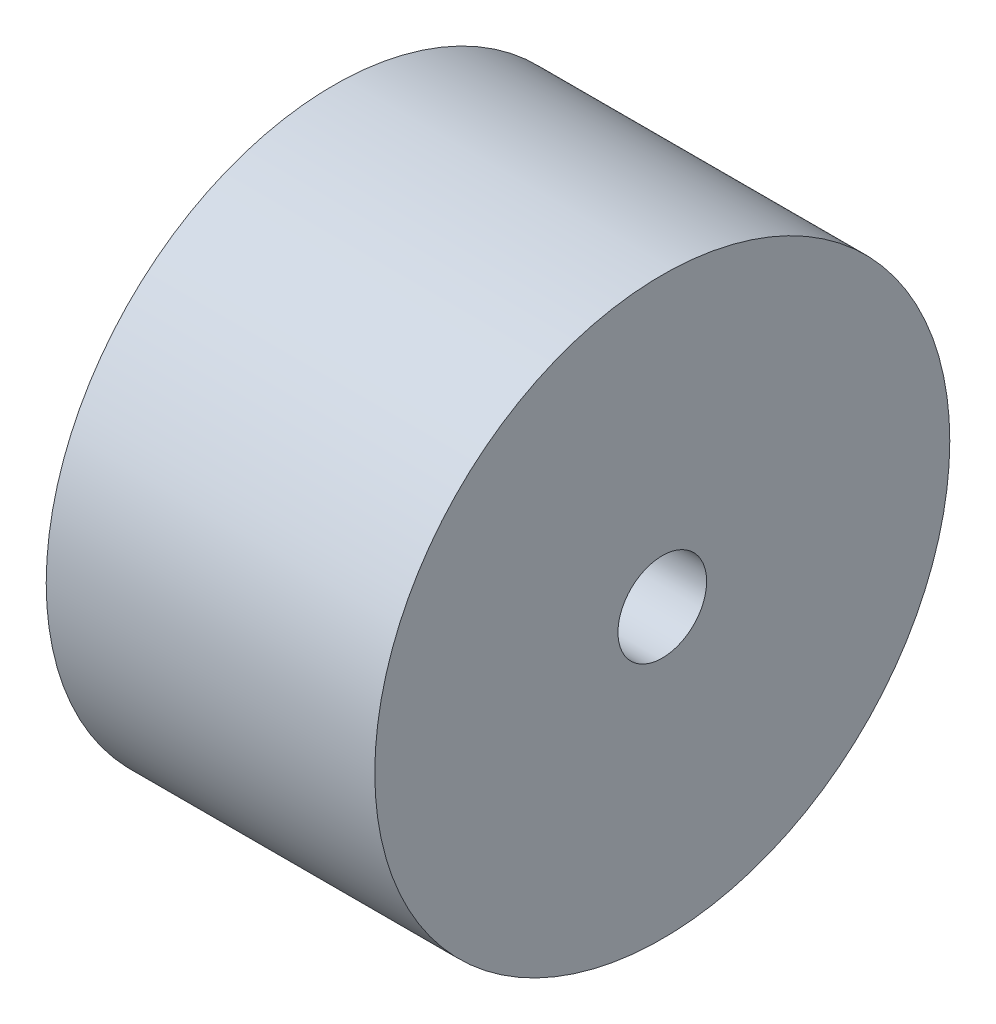
ISO-10303-21;
HEADER;
FILE_DESCRIPTION(('STEP AP214'),'2;1');
FILE_NAME('part.step','',(''),(''),'','','');
FILE_SCHEMA(('AUTOMOTIVE_DESIGN { 1 0 10303 214 1 1 1 1 }'));
ENDSEC;
DATA;
#1=APPLICATION_CONTEXT('core data for automotive mechanical design processes');
#2=APPLICATION_PROTOCOL_DEFINITION('international standard','automotive_design',2000,#1);
#3=PRODUCT_CONTEXT('',#1,'mechanical');
#4=PRODUCT('Part','Part','',(#3));
#5=PRODUCT_RELATED_PRODUCT_CATEGORY('part','',(#4));
#6=PRODUCT_DEFINITION_FORMATION('','',#4);
#7=PRODUCT_DEFINITION_CONTEXT('part definition',#1,'design');
#8=PRODUCT_DEFINITION('design','',#6,#7);
#9=PRODUCT_DEFINITION_SHAPE('','',#8);
#10=(LENGTH_UNIT() NAMED_UNIT(*) SI_UNIT(.MILLI.,.METRE.));
#11=(NAMED_UNIT(*) PLANE_ANGLE_UNIT() SI_UNIT($,.RADIAN.));
#12=(NAMED_UNIT(*) SI_UNIT($,.STERADIAN.) SOLID_ANGLE_UNIT());
#13=UNCERTAINTY_MEASURE_WITH_UNIT(LENGTH_MEASURE(1.E-05),#10,'distance_accuracy_value','');
#14=(GEOMETRIC_REPRESENTATION_CONTEXT(3) GLOBAL_UNCERTAINTY_ASSIGNED_CONTEXT((#13)) GLOBAL_UNIT_ASSIGNED_CONTEXT((#10,
#11,#12)) REPRESENTATION_CONTEXT('',''));
#15=CARTESIAN_POINT('',(0.,0.,0.));
#16=DIRECTION('',(0.,0.,1.));
#17=DIRECTION('',(1.,0.,0.));
#18=AXIS2_PLACEMENT_3D('',#15,#16,#17);
#19=CARTESIAN_POINT('',(20.,0.,0.));
#20=DIRECTION('',(-1.,0.,0.));
#21=DIRECTION('',(0.,0.,1.));
#22=AXIS2_PLACEMENT_3D('',#19,#20,#21);
#23=CYLINDRICAL_SURFACE('',#22,17.5);
#24=CARTESIAN_POINT('',(20.,0.,0.));
#25=DIRECTION('',(1.,0.,0.));
#26=DIRECTION('',(0.,0.,-1.));
#27=AXIS2_PLACEMENT_3D('',#24,#25,#26);
#28=CIRCLE('',#27,17.5);
#29=CARTESIAN_POINT('',(20.,0.,-17.5));
#30=VERTEX_POINT('',#29);
#31=EDGE_CURVE('E10',#30,#30,#28,.T.);
#32=ORIENTED_EDGE('',*,*,#31,.F.);
#33=EDGE_LOOP('',(#32));
#34=FACE_BOUND('',#33,.T.);
#35=CARTESIAN_POINT('',(0.,0.,0.));
#36=DIRECTION('',(1.,0.,0.));
#37=DIRECTION('',(0.,0.,-1.));
#38=AXIS2_PLACEMENT_3D('',#35,#36,#37);
#39=CIRCLE('',#38,17.5);
#40=CARTESIAN_POINT('',(0.,0.,-17.5));
#41=VERTEX_POINT('',#40);
#42=EDGE_CURVE('E33',#41,#41,#39,.T.);
#43=ORIENTED_EDGE('',*,*,#42,.T.);
#44=EDGE_LOOP('',(#43));
#45=FACE_BOUND('',#44,.T.);
#46=ADVANCED_FACE('F30',(#34,#45),#23,.T.);
#47=CARTESIAN_POINT('',(20.,0.,0.));
#48=DIRECTION('',(1.,0.,0.));
#49=DIRECTION('',(0.,0.,-1.));
#50=AXIS2_PLACEMENT_3D('',#47,#48,#49);
#51=PLANE('',#50);
#52=CARTESIAN_POINT('',(20.,0.,0.));
#53=DIRECTION('',(1.,0.,0.));
#54=DIRECTION('',(0.,0.,-1.));
#55=AXIS2_PLACEMENT_3D('',#52,#53,#54);
#56=CIRCLE('',#55,2.7);
#57=CARTESIAN_POINT('',(20.,0.,-2.7));
#58=VERTEX_POINT('',#57);
#59=EDGE_CURVE('E42',#58,#58,#56,.T.);
#60=ORIENTED_EDGE('',*,*,#59,.F.);
#61=EDGE_LOOP('',(#60));
#62=FACE_BOUND('',#61,.T.);
#63=ORIENTED_EDGE('',*,*,#31,.T.);
#64=EDGE_LOOP('',(#63));
#65=FACE_BOUND('',#64,.T.);
#66=ADVANCED_FACE('F57',(#62,#65),#51,.T.);
#67=CARTESIAN_POINT('',(0.,0.,0.));
#68=DIRECTION('',(1.,0.,0.));
#69=DIRECTION('',(0.,0.,-1.));
#70=AXIS2_PLACEMENT_3D('',#67,#68,#69);
#71=PLANE('',#70);
#72=CARTESIAN_POINT('',(0.,0.,0.));
#73=DIRECTION('',(1.,0.,0.));
#74=DIRECTION('',(0.,0.,-1.));
#75=AXIS2_PLACEMENT_3D('',#72,#73,#74);
#76=CIRCLE('',#75,2.7);
#77=CARTESIAN_POINT('',(0.,0.,-2.7));
#78=VERTEX_POINT('',#77);
#79=EDGE_CURVE('E40',#78,#78,#76,.T.);
#80=ORIENTED_EDGE('',*,*,#79,.T.);
#81=EDGE_LOOP('',(#80));
#82=FACE_BOUND('',#81,.T.);
#83=ORIENTED_EDGE('',*,*,#42,.F.);
#84=EDGE_LOOP('',(#83));
#85=FACE_BOUND('',#84,.T.);
#86=ADVANCED_FACE('F48',(#82,#85),#71,.F.);
#87=CARTESIAN_POINT('',(0.,0.,0.));
#88=DIRECTION('',(1.,0.,0.));
#89=DIRECTION('',(0.,0.,-1.));
#90=AXIS2_PLACEMENT_3D('',#87,#88,#89);
#91=CYLINDRICAL_SURFACE('',#90,2.7);
#92=ORIENTED_EDGE('',*,*,#79,.F.);
#93=EDGE_LOOP('',(#92));
#94=FACE_BOUND('',#93,.T.);
#95=ORIENTED_EDGE('',*,*,#59,.T.);
#96=EDGE_LOOP('',(#95));
#97=FACE_BOUND('',#96,.T.);
#98=ADVANCED_FACE('F51',(#94,#97),#91,.F.);
#99=CLOSED_SHELL('',(#46,#66,#86,#98));
#100=MANIFOLD_SOLID_BREP('B2',#99);
#101=ADVANCED_BREP_SHAPE_REPRESENTATION('',(#18,#100),#14);
#102=SHAPE_DEFINITION_REPRESENTATION(#9,#101);
ENDSEC;
END-ISO-10303-21;
